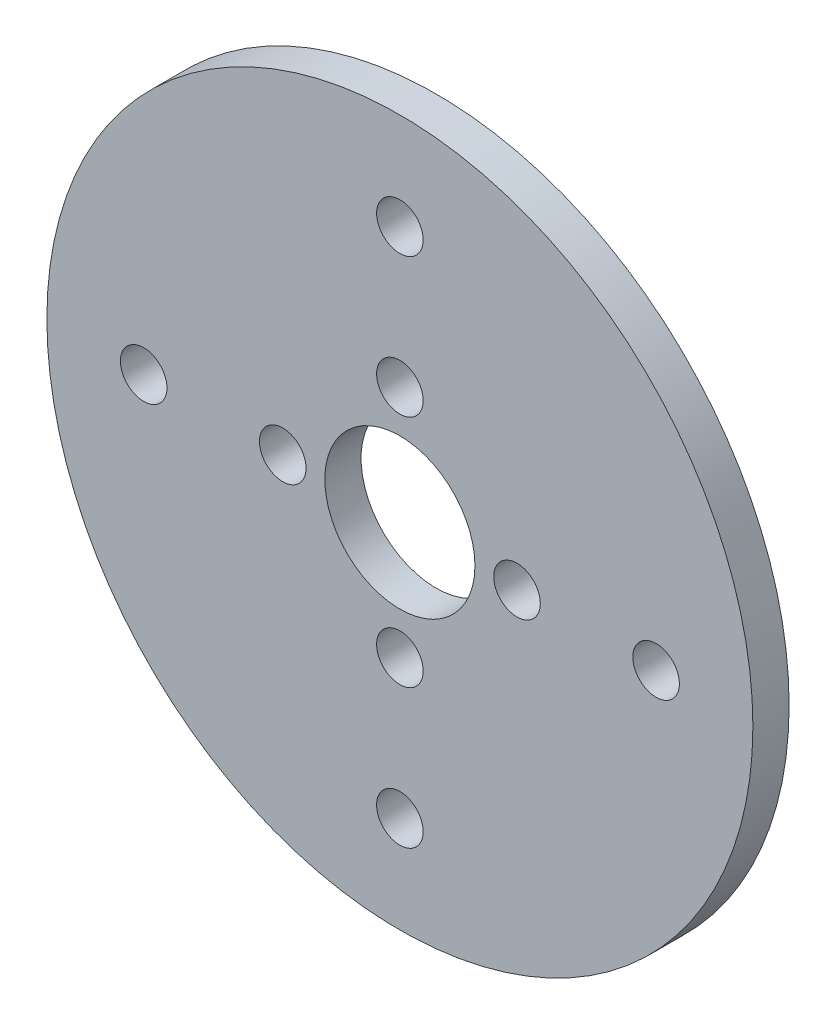
ISO-10303-21;
HEADER;
FILE_DESCRIPTION(('STEP AP214'),'2;1');
FILE_NAME('part.step','',(''),(''),'','','');
FILE_SCHEMA(('AUTOMOTIVE_DESIGN { 1 0 10303 214 1 1 1 1 }'));
ENDSEC;
DATA;
#1=APPLICATION_CONTEXT('core data for automotive mechanical design processes');
#2=APPLICATION_PROTOCOL_DEFINITION('international standard','automotive_design',2000,#1);
#3=PRODUCT_CONTEXT('',#1,'mechanical');
#4=PRODUCT('Part','Part','',(#3));
#5=PRODUCT_RELATED_PRODUCT_CATEGORY('part','',(#4));
#6=PRODUCT_DEFINITION_FORMATION('','',#4);
#7=PRODUCT_DEFINITION_CONTEXT('part definition',#1,'design');
#8=PRODUCT_DEFINITION('design','',#6,#7);
#9=PRODUCT_DEFINITION_SHAPE('','',#8);
#10=(LENGTH_UNIT() NAMED_UNIT(*) SI_UNIT(.MILLI.,.METRE.));
#11=(NAMED_UNIT(*) PLANE_ANGLE_UNIT() SI_UNIT($,.RADIAN.));
#12=(NAMED_UNIT(*) SI_UNIT($,.STERADIAN.) SOLID_ANGLE_UNIT());
#13=UNCERTAINTY_MEASURE_WITH_UNIT(LENGTH_MEASURE(1.E-05),#10,'distance_accuracy_value','');
#14=(GEOMETRIC_REPRESENTATION_CONTEXT(3) GLOBAL_UNCERTAINTY_ASSIGNED_CONTEXT((#13)) GLOBAL_UNIT_ASSIGNED_CONTEXT((#10,
#11,#12)) REPRESENTATION_CONTEXT('',''));
#15=CARTESIAN_POINT('',(0.,0.,0.));
#16=DIRECTION('',(0.,0.,1.));
#17=DIRECTION('',(1.,0.,0.));
#18=AXIS2_PLACEMENT_3D('',#15,#16,#17);
#19=CARTESIAN_POINT('',(0.,0.,1.75));
#20=DIRECTION('',(0.,0.,-1.));
#21=DIRECTION('',(-1.,0.,0.));
#22=AXIS2_PLACEMENT_3D('',#19,#20,#21);
#23=CYLINDRICAL_SURFACE('',#22,34.1);
#24=CARTESIAN_POINT('',(0.,0.,1.75));
#25=DIRECTION('',(0.,0.,1.));
#26=DIRECTION('',(1.,0.,0.));
#27=AXIS2_PLACEMENT_3D('',#24,#25,#26);
#28=CIRCLE('',#27,34.1);
#29=CARTESIAN_POINT('',(34.1,0.,1.75));
#30=VERTEX_POINT('',#29);
#31=EDGE_CURVE('E10',#30,#30,#28,.T.);
#32=ORIENTED_EDGE('',*,*,#31,.F.);
#33=EDGE_LOOP('',(#32));
#34=FACE_BOUND('',#33,.T.);
#35=CARTESIAN_POINT('',(0.,0.,-1.75));
#36=DIRECTION('',(0.,0.,1.));
#37=DIRECTION('',(1.,0.,0.));
#38=AXIS2_PLACEMENT_3D('',#35,#36,#37);
#39=CIRCLE('',#38,34.1);
#40=CARTESIAN_POINT('',(34.1,0.,-1.75));
#41=VERTEX_POINT('',#40);
#42=EDGE_CURVE('E42',#41,#41,#39,.T.);
#43=ORIENTED_EDGE('',*,*,#42,.T.);
#44=EDGE_LOOP('',(#43));
#45=FACE_BOUND('',#44,.T.);
#46=ADVANCED_FACE('F39',(#34,#45),#23,.T.);
#47=CARTESIAN_POINT('',(0.,0.,1.75));
#48=DIRECTION('',(0.,0.,1.));
#49=DIRECTION('',(1.,0.,0.));
#50=AXIS2_PLACEMENT_3D('',#47,#48,#49);
#51=PLANE('',#50);
#52=CARTESIAN_POINT('',(0.,0.,1.75));
#53=DIRECTION('',(0.,0.,1.));
#54=DIRECTION('',(1.,0.,0.));
#55=AXIS2_PLACEMENT_3D('',#52,#53,#54);
#56=CIRCLE('',#55,7.25);
#57=CARTESIAN_POINT('',(7.25,0.,1.75));
#58=VERTEX_POINT('',#57);
#59=EDGE_CURVE('E99',#58,#58,#56,.T.);
#60=ORIENTED_EDGE('',*,*,#59,.F.);
#61=EDGE_LOOP('',(#60));
#62=FACE_BOUND('',#61,.T.);
#63=CARTESIAN_POINT('',(0.,24.75,1.75));
#64=DIRECTION('',(0.,0.,1.));
#65=DIRECTION('',(1.,0.,0.));
#66=AXIS2_PLACEMENT_3D('',#63,#64,#65);
#67=CIRCLE('',#66,2.25);
#68=CARTESIAN_POINT('',(2.25,24.75,1.75));
#69=VERTEX_POINT('',#68);
#70=EDGE_CURVE('E64',#69,#69,#67,.T.);
#71=ORIENTED_EDGE('',*,*,#70,.F.);
#72=EDGE_LOOP('',(#71));
#73=FACE_BOUND('',#72,.T.);
#74=CARTESIAN_POINT('',(0.,-11.3137085,1.75));
#75=DIRECTION('',(0.,0.,1.));
#76=DIRECTION('',(1.,0.,0.));
#77=AXIS2_PLACEMENT_3D('',#74,#75,#76);
#78=CIRCLE('',#77,2.25);
#79=CARTESIAN_POINT('',(2.25,-11.3137085,1.75));
#80=VERTEX_POINT('',#79);
#81=EDGE_CURVE('E69',#80,#80,#78,.T.);
#82=ORIENTED_EDGE('',*,*,#81,.F.);
#83=EDGE_LOOP('',(#82));
#84=FACE_BOUND('',#83,.T.);
#85=CARTESIAN_POINT('',(-24.75,0.,1.75));
#86=DIRECTION('',(0.,0.,1.));
#87=DIRECTION('',(1.,0.,0.));
#88=AXIS2_PLACEMENT_3D('',#85,#86,#87);
#89=CIRCLE('',#88,2.25);
#90=CARTESIAN_POINT('',(-22.5,0.,1.75));
#91=VERTEX_POINT('',#90);
#92=EDGE_CURVE('E80',#91,#91,#89,.T.);
#93=ORIENTED_EDGE('',*,*,#92,.F.);
#94=EDGE_LOOP('',(#93));
#95=FACE_BOUND('',#94,.T.);
#96=CARTESIAN_POINT('',(-11.3137085,0.,1.75));
#97=DIRECTION('',(0.,0.,1.));
#98=DIRECTION('',(1.,0.,0.));
#99=AXIS2_PLACEMENT_3D('',#96,#97,#98);
#100=CIRCLE('',#99,2.25);
#101=CARTESIAN_POINT('',(-9.0637085,0.,1.75));
#102=VERTEX_POINT('',#101);
#103=EDGE_CURVE('E81',#102,#102,#100,.T.);
#104=ORIENTED_EDGE('',*,*,#103,.F.);
#105=EDGE_LOOP('',(#104));
#106=FACE_BOUND('',#105,.T.);
#107=CARTESIAN_POINT('',(0.,11.3137085,1.75));
#108=DIRECTION('',(0.,0.,1.));
#109=DIRECTION('',(1.,0.,0.));
#110=AXIS2_PLACEMENT_3D('',#107,#108,#109);
#111=CIRCLE('',#110,2.25);
#112=CARTESIAN_POINT('',(2.25,11.3137085,1.75));
#113=VERTEX_POINT('',#112);
#114=EDGE_CURVE('E61',#113,#113,#111,.T.);
#115=ORIENTED_EDGE('',*,*,#114,.F.);
#116=EDGE_LOOP('',(#115));
#117=FACE_BOUND('',#116,.T.);
#118=CARTESIAN_POINT('',(24.75,0.,1.75));
#119=DIRECTION('',(0.,0.,1.));
#120=DIRECTION('',(1.,0.,0.));
#121=AXIS2_PLACEMENT_3D('',#118,#119,#120);
#122=CIRCLE('',#121,2.25);
#123=CARTESIAN_POINT('',(27.,0.,1.75));
#124=VERTEX_POINT('',#123);
#125=EDGE_CURVE('E54',#124,#124,#122,.T.);
#126=ORIENTED_EDGE('',*,*,#125,.F.);
#127=EDGE_LOOP('',(#126));
#128=FACE_BOUND('',#127,.T.);
#129=CARTESIAN_POINT('',(11.3137085,0.,1.75));
#130=DIRECTION('',(0.,0.,1.));
#131=DIRECTION('',(1.,0.,0.));
#132=AXIS2_PLACEMENT_3D('',#129,#130,#131);
#133=CIRCLE('',#132,2.25);
#134=CARTESIAN_POINT('',(13.5637085,0.,1.75));
#135=VERTEX_POINT('',#134);
#136=EDGE_CURVE('E55',#135,#135,#133,.T.);
#137=ORIENTED_EDGE('',*,*,#136,.F.);
#138=EDGE_LOOP('',(#137));
#139=FACE_BOUND('',#138,.T.);
#140=CARTESIAN_POINT('',(0.,-24.75,1.75));
#141=DIRECTION('',(0.,0.,1.));
#142=DIRECTION('',(1.,0.,0.));
#143=AXIS2_PLACEMENT_3D('',#140,#141,#142);
#144=CIRCLE('',#143,2.25);
#145=CARTESIAN_POINT('',(2.25,-24.75,1.75));
#146=VERTEX_POINT('',#145);
#147=EDGE_CURVE('E68',#146,#146,#144,.T.);
#148=ORIENTED_EDGE('',*,*,#147,.F.);
#149=EDGE_LOOP('',(#148));
#150=FACE_BOUND('',#149,.T.);
#151=ORIENTED_EDGE('',*,*,#31,.T.);
#152=EDGE_LOOP('',(#151));
#153=FACE_BOUND('',#152,.T.);
#154=ADVANCED_FACE('F115',(#62,#73,#84,#95,#106,#117,#128,#139,#150,#153),#51,.T.);
#155=CARTESIAN_POINT('',(0.,0.,-1.75));
#156=DIRECTION('',(0.,0.,1.));
#157=DIRECTION('',(1.,0.,0.));
#158=AXIS2_PLACEMENT_3D('',#155,#156,#157);
#159=PLANE('',#158);
#160=CARTESIAN_POINT('',(0.,0.,-1.75));
#161=DIRECTION('',(0.,0.,1.));
#162=DIRECTION('',(1.,0.,0.));
#163=AXIS2_PLACEMENT_3D('',#160,#161,#162);
#164=CIRCLE('',#163,7.25);
#165=CARTESIAN_POINT('',(7.25,0.,-1.75));
#166=VERTEX_POINT('',#165);
#167=EDGE_CURVE('E92',#166,#166,#164,.T.);
#168=ORIENTED_EDGE('',*,*,#167,.T.);
#169=EDGE_LOOP('',(#168));
#170=FACE_BOUND('',#169,.T.);
#171=CARTESIAN_POINT('',(0.,24.75,-1.75));
#172=DIRECTION('',(0.,0.,1.));
#173=DIRECTION('',(1.,0.,0.));
#174=AXIS2_PLACEMENT_3D('',#171,#172,#173);
#175=CIRCLE('',#174,2.25);
#176=CARTESIAN_POINT('',(2.25,24.75,-1.75));
#177=VERTEX_POINT('',#176);
#178=EDGE_CURVE('E49',#177,#177,#175,.T.);
#179=ORIENTED_EDGE('',*,*,#178,.T.);
#180=EDGE_LOOP('',(#179));
#181=FACE_BOUND('',#180,.T.);
#182=CARTESIAN_POINT('',(0.,-11.3137085,-1.75));
#183=DIRECTION('',(0.,0.,1.));
#184=DIRECTION('',(1.,0.,0.));
#185=AXIS2_PLACEMENT_3D('',#182,#183,#184);
#186=CIRCLE('',#185,2.25);
#187=CARTESIAN_POINT('',(2.25,-11.3137085,-1.75));
#188=VERTEX_POINT('',#187);
#189=EDGE_CURVE('E84',#188,#188,#186,.T.);
#190=ORIENTED_EDGE('',*,*,#189,.T.);
#191=EDGE_LOOP('',(#190));
#192=FACE_BOUND('',#191,.T.);
#193=CARTESIAN_POINT('',(-24.75,0.,-1.75));
#194=DIRECTION('',(0.,0.,1.));
#195=DIRECTION('',(1.,0.,0.));
#196=AXIS2_PLACEMENT_3D('',#193,#194,#195);
#197=CIRCLE('',#196,2.25);
#198=CARTESIAN_POINT('',(-22.5,0.,-1.75));
#199=VERTEX_POINT('',#198);
#200=EDGE_CURVE('E77',#199,#199,#197,.T.);
#201=ORIENTED_EDGE('',*,*,#200,.T.);
#202=EDGE_LOOP('',(#201));
#203=FACE_BOUND('',#202,.T.);
#204=CARTESIAN_POINT('',(-11.3137085,0.,-1.75));
#205=DIRECTION('',(0.,0.,1.));
#206=DIRECTION('',(1.,0.,0.));
#207=AXIS2_PLACEMENT_3D('',#204,#205,#206);
#208=CIRCLE('',#207,2.25);
#209=CARTESIAN_POINT('',(-9.0637085,0.,-1.75));
#210=VERTEX_POINT('',#209);
#211=EDGE_CURVE('E89',#210,#210,#208,.T.);
#212=ORIENTED_EDGE('',*,*,#211,.T.);
#213=EDGE_LOOP('',(#212));
#214=FACE_BOUND('',#213,.T.);
#215=CARTESIAN_POINT('',(0.,11.3137085,-1.75));
#216=DIRECTION('',(0.,0.,1.));
#217=DIRECTION('',(1.,0.,0.));
#218=AXIS2_PLACEMENT_3D('',#215,#216,#217);
#219=CIRCLE('',#218,2.25);
#220=CARTESIAN_POINT('',(2.25,11.3137085,-1.75));
#221=VERTEX_POINT('',#220);
#222=EDGE_CURVE('E58',#221,#221,#219,.T.);
#223=ORIENTED_EDGE('',*,*,#222,.T.);
#224=EDGE_LOOP('',(#223));
#225=FACE_BOUND('',#224,.T.);
#226=CARTESIAN_POINT('',(24.75,0.,-1.75));
#227=DIRECTION('',(0.,0.,1.));
#228=DIRECTION('',(1.,0.,0.));
#229=AXIS2_PLACEMENT_3D('',#226,#227,#228);
#230=CIRCLE('',#229,2.25);
#231=CARTESIAN_POINT('',(27.,0.,-1.75));
#232=VERTEX_POINT('',#231);
#233=EDGE_CURVE('E51',#232,#232,#230,.T.);
#234=ORIENTED_EDGE('',*,*,#233,.T.);
#235=EDGE_LOOP('',(#234));
#236=FACE_BOUND('',#235,.T.);
#237=CARTESIAN_POINT('',(11.3137085,0.,-1.75));
#238=DIRECTION('',(0.,0.,1.));
#239=DIRECTION('',(1.,0.,0.));
#240=AXIS2_PLACEMENT_3D('',#237,#238,#239);
#241=CIRCLE('',#240,2.25);
#242=CARTESIAN_POINT('',(13.5637085,0.,-1.75));
#243=VERTEX_POINT('',#242);
#244=EDGE_CURVE('E72',#243,#243,#241,.T.);
#245=ORIENTED_EDGE('',*,*,#244,.T.);
#246=EDGE_LOOP('',(#245));
#247=FACE_BOUND('',#246,.T.);
#248=CARTESIAN_POINT('',(0.,-24.75,-1.75));
#249=DIRECTION('',(0.,0.,1.));
#250=DIRECTION('',(1.,0.,0.));
#251=AXIS2_PLACEMENT_3D('',#248,#249,#250);
#252=CIRCLE('',#251,2.25);
#253=CARTESIAN_POINT('',(2.25,-24.75,-1.75));
#254=VERTEX_POINT('',#253);
#255=EDGE_CURVE('E65',#254,#254,#252,.T.);
#256=ORIENTED_EDGE('',*,*,#255,.T.);
#257=EDGE_LOOP('',(#256));
#258=FACE_BOUND('',#257,.T.);
#259=ORIENTED_EDGE('',*,*,#42,.F.);
#260=EDGE_LOOP('',(#259));
#261=FACE_BOUND('',#260,.T.);
#262=ADVANCED_FACE('F105',(#170,#181,#192,#203,#214,#225,#236,#247,#258,#261),#159,.F.);
#263=CARTESIAN_POINT('',(0.,-24.75,-1.75));
#264=DIRECTION('',(0.,0.,1.));
#265=DIRECTION('',(1.,0.,0.));
#266=AXIS2_PLACEMENT_3D('',#263,#264,#265);
#267=CYLINDRICAL_SURFACE('',#266,2.25);
#268=ORIENTED_EDGE('',*,*,#255,.F.);
#269=EDGE_LOOP('',(#268));
#270=FACE_BOUND('',#269,.T.);
#271=ORIENTED_EDGE('',*,*,#147,.T.);
#272=EDGE_LOOP('',(#271));
#273=FACE_BOUND('',#272,.T.);
#274=ADVANCED_FACE('F135',(#270,#273),#267,.F.);
#275=CARTESIAN_POINT('',(11.3137085,0.,-1.75));
#276=DIRECTION('',(0.,0.,1.));
#277=DIRECTION('',(1.,0.,0.));
#278=AXIS2_PLACEMENT_3D('',#275,#276,#277);
#279=CYLINDRICAL_SURFACE('',#278,2.25);
#280=ORIENTED_EDGE('',*,*,#244,.F.);
#281=EDGE_LOOP('',(#280));
#282=FACE_BOUND('',#281,.T.);
#283=ORIENTED_EDGE('',*,*,#136,.T.);
#284=EDGE_LOOP('',(#283));
#285=FACE_BOUND('',#284,.T.);
#286=ADVANCED_FACE('F137',(#282,#285),#279,.F.);
#287=CARTESIAN_POINT('',(24.75,0.,-1.75));
#288=DIRECTION('',(0.,0.,1.));
#289=DIRECTION('',(1.,0.,0.));
#290=AXIS2_PLACEMENT_3D('',#287,#288,#289);
#291=CYLINDRICAL_SURFACE('',#290,2.25);
#292=ORIENTED_EDGE('',*,*,#233,.F.);
#293=EDGE_LOOP('',(#292));
#294=FACE_BOUND('',#293,.T.);
#295=ORIENTED_EDGE('',*,*,#125,.T.);
#296=EDGE_LOOP('',(#295));
#297=FACE_BOUND('',#296,.T.);
#298=ADVANCED_FACE('F144',(#294,#297),#291,.F.);
#299=CARTESIAN_POINT('',(0.,11.3137085,-1.75));
#300=DIRECTION('',(0.,0.,1.));
#301=DIRECTION('',(1.,0.,0.));
#302=AXIS2_PLACEMENT_3D('',#299,#300,#301);
#303=CYLINDRICAL_SURFACE('',#302,2.25);
#304=ORIENTED_EDGE('',*,*,#222,.F.);
#305=EDGE_LOOP('',(#304));
#306=FACE_BOUND('',#305,.T.);
#307=ORIENTED_EDGE('',*,*,#114,.T.);
#308=EDGE_LOOP('',(#307));
#309=FACE_BOUND('',#308,.T.);
#310=ADVANCED_FACE('F189',(#306,#309),#303,.F.);
#311=CARTESIAN_POINT('',(-11.3137085,0.,-1.75));
#312=DIRECTION('',(0.,0.,1.));
#313=DIRECTION('',(1.,0.,0.));
#314=AXIS2_PLACEMENT_3D('',#311,#312,#313);
#315=CYLINDRICAL_SURFACE('',#314,2.25);
#316=ORIENTED_EDGE('',*,*,#211,.F.);
#317=EDGE_LOOP('',(#316));
#318=FACE_BOUND('',#317,.T.);
#319=ORIENTED_EDGE('',*,*,#103,.T.);
#320=EDGE_LOOP('',(#319));
#321=FACE_BOUND('',#320,.T.);
#322=ADVANCED_FACE('F199',(#318,#321),#315,.F.);
#323=CARTESIAN_POINT('',(-24.75,0.,-1.75));
#324=DIRECTION('',(0.,0.,1.));
#325=DIRECTION('',(1.,0.,0.));
#326=AXIS2_PLACEMENT_3D('',#323,#324,#325);
#327=CYLINDRICAL_SURFACE('',#326,2.25);
#328=ORIENTED_EDGE('',*,*,#200,.F.);
#329=EDGE_LOOP('',(#328));
#330=FACE_BOUND('',#329,.T.);
#331=ORIENTED_EDGE('',*,*,#92,.T.);
#332=EDGE_LOOP('',(#331));
#333=FACE_BOUND('',#332,.T.);
#334=ADVANCED_FACE('F208',(#330,#333),#327,.F.);
#335=CARTESIAN_POINT('',(0.,-11.3137085,-1.75));
#336=DIRECTION('',(0.,0.,1.));
#337=DIRECTION('',(1.,0.,0.));
#338=AXIS2_PLACEMENT_3D('',#335,#336,#337);
#339=CYLINDRICAL_SURFACE('',#338,2.25);
#340=ORIENTED_EDGE('',*,*,#189,.F.);
#341=EDGE_LOOP('',(#340));
#342=FACE_BOUND('',#341,.T.);
#343=ORIENTED_EDGE('',*,*,#81,.T.);
#344=EDGE_LOOP('',(#343));
#345=FACE_BOUND('',#344,.T.);
#346=ADVANCED_FACE('F218',(#342,#345),#339,.F.);
#347=CARTESIAN_POINT('',(0.,24.75,-1.75));
#348=DIRECTION('',(0.,0.,1.));
#349=DIRECTION('',(1.,0.,0.));
#350=AXIS2_PLACEMENT_3D('',#347,#348,#349);
#351=CYLINDRICAL_SURFACE('',#350,2.25);
#352=ORIENTED_EDGE('',*,*,#178,.F.);
#353=EDGE_LOOP('',(#352));
#354=FACE_BOUND('',#353,.T.);
#355=ORIENTED_EDGE('',*,*,#70,.T.);
#356=EDGE_LOOP('',(#355));
#357=FACE_BOUND('',#356,.T.);
#358=ADVANCED_FACE('F111',(#354,#357),#351,.F.);
#359=CARTESIAN_POINT('',(0.,0.,-1.75));
#360=DIRECTION('',(0.,0.,1.));
#361=DIRECTION('',(1.,0.,0.));
#362=AXIS2_PLACEMENT_3D('',#359,#360,#361);
#363=CYLINDRICAL_SURFACE('',#362,7.25);
#364=ORIENTED_EDGE('',*,*,#167,.F.);
#365=EDGE_LOOP('',(#364));
#366=FACE_BOUND('',#365,.T.);
#367=ORIENTED_EDGE('',*,*,#59,.T.);
#368=EDGE_LOOP('',(#367));
#369=FACE_BOUND('',#368,.T.);
#370=ADVANCED_FACE('F108',(#366,#369),#363,.F.);
#371=CLOSED_SHELL('',(#46,#154,#262,#274,#286,#298,#310,#322,#334,#346,#358,#370));
#372=MANIFOLD_SOLID_BREP('B2',#371);
#373=ADVANCED_BREP_SHAPE_REPRESENTATION('',(#18,#372),#14);
#374=SHAPE_DEFINITION_REPRESENTATION(#9,#373);
ENDSEC;
END-ISO-10303-21;
